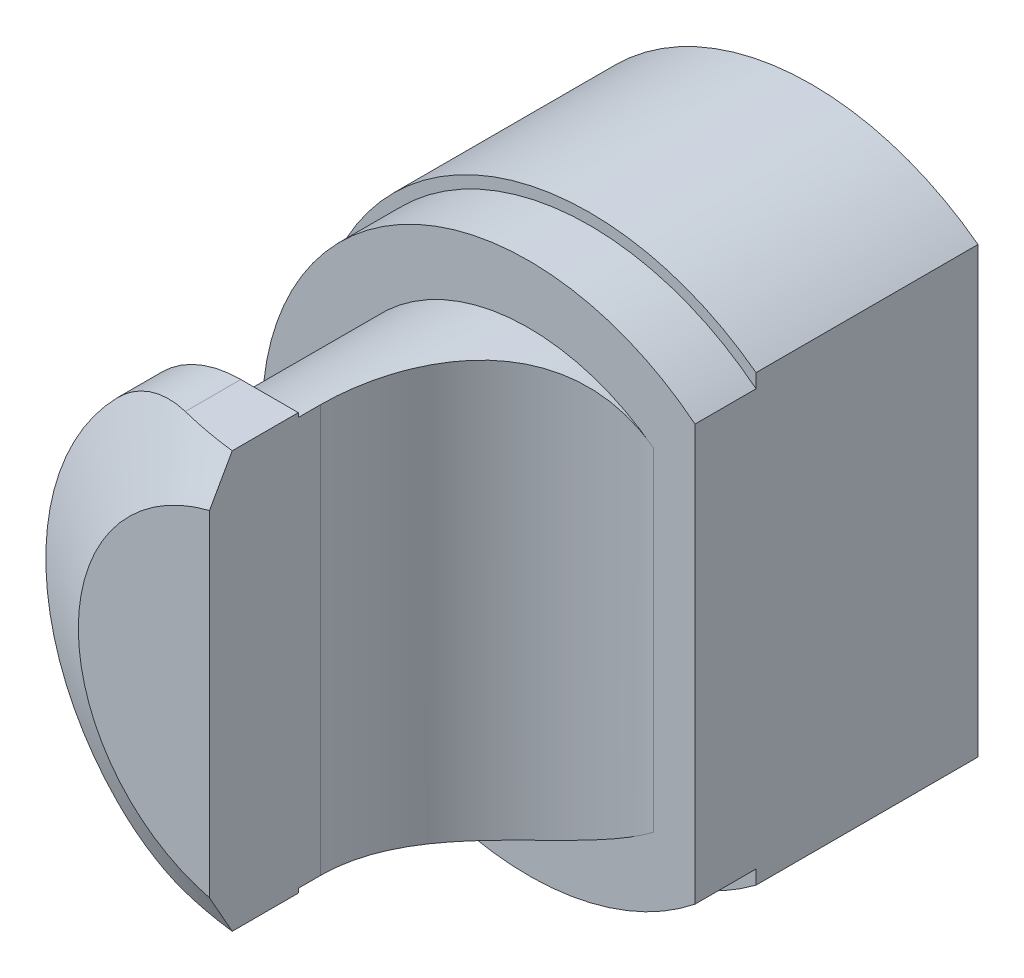
ISO-10303-21;
HEADER;
FILE_DESCRIPTION(('STEP AP214'),'2;1');
FILE_NAME('part.step','',(''),(''),'','','');
FILE_SCHEMA(('AUTOMOTIVE_DESIGN { 1 0 10303 214 1 1 1 1 }'));
ENDSEC;
DATA;
#1=APPLICATION_CONTEXT('core data for automotive mechanical design processes');
#2=APPLICATION_PROTOCOL_DEFINITION('international standard','automotive_design',2000,#1);
#3=PRODUCT_CONTEXT('',#1,'mechanical');
#4=PRODUCT('Part','Part','',(#3));
#5=PRODUCT_RELATED_PRODUCT_CATEGORY('part','',(#4));
#6=PRODUCT_DEFINITION_FORMATION('','',#4);
#7=PRODUCT_DEFINITION_CONTEXT('part definition',#1,'design');
#8=PRODUCT_DEFINITION('design','',#6,#7);
#9=PRODUCT_DEFINITION_SHAPE('','',#8);
#10=(LENGTH_UNIT() NAMED_UNIT(*) SI_UNIT(.MILLI.,.METRE.));
#11=(NAMED_UNIT(*) PLANE_ANGLE_UNIT() SI_UNIT($,.RADIAN.));
#12=(NAMED_UNIT(*) SI_UNIT($,.STERADIAN.) SOLID_ANGLE_UNIT());
#13=UNCERTAINTY_MEASURE_WITH_UNIT(LENGTH_MEASURE(1.E-05),#10,'distance_accuracy_value','');
#14=(GEOMETRIC_REPRESENTATION_CONTEXT(3) GLOBAL_UNCERTAINTY_ASSIGNED_CONTEXT((#13)) GLOBAL_UNIT_ASSIGNED_CONTEXT((#10,
#11,#12)) REPRESENTATION_CONTEXT('',''));
#15=CARTESIAN_POINT('',(0.,0.,0.));
#16=DIRECTION('',(0.,0.,1.));
#17=DIRECTION('',(1.,0.,0.));
#18=AXIS2_PLACEMENT_3D('',#15,#16,#17);
#19=CARTESIAN_POINT('',(0.,0.,3.05));
#20=DIRECTION('',(0.,0.,-1.));
#21=DIRECTION('',(-1.,0.,0.));
#22=AXIS2_PLACEMENT_3D('',#19,#20,#21);
#23=CYLINDRICAL_SURFACE('',#22,2.25);
#24=CARTESIAN_POINT('',(0.,0.,2.65));
#25=DIRECTION('',(0.,0.,1.));
#26=DIRECTION('',(1.,0.,0.));
#27=AXIS2_PLACEMENT_3D('',#24,#25,#26);
#28=CIRCLE('',#27,2.25);
#29=CARTESIAN_POINT('',(-1.60682139642214,-1.575,2.65));
#30=VERTEX_POINT('',#29);
#31=CARTESIAN_POINT('',(-1.60682139642214,1.575,2.65));
#32=VERTEX_POINT('',#31);
#33=EDGE_CURVE('E283',#30,#32,#28,.F.);
#34=ORIENTED_EDGE('',*,*,#33,.T.);
#35=DIRECTION('',(0.,0.,-1.));
#36=VECTOR('',#35,1.);
#37=CARTESIAN_POINT('',(-1.60682139642214,1.575,3.05));
#38=LINE('',#37,#36);
#39=CARTESIAN_POINT('',(-1.60682139642214,1.575,2.25));
#40=VERTEX_POINT('',#39);
#41=EDGE_CURVE('E245',#32,#40,#38,.T.);
#42=ORIENTED_EDGE('',*,*,#41,.T.);
#43=CARTESIAN_POINT('',(0.,0.,2.25));
#44=DIRECTION('',(0.,0.,1.));
#45=DIRECTION('',(1.,0.,0.));
#46=AXIS2_PLACEMENT_3D('',#43,#44,#45);
#47=CIRCLE('',#46,2.25);
#48=CARTESIAN_POINT('',(-1.60682139642214,-1.575,2.25));
#49=VERTEX_POINT('',#48);
#50=EDGE_CURVE('E310',#40,#49,#47,.T.);
#51=ORIENTED_EDGE('',*,*,#50,.T.);
#52=DIRECTION('',(0.,0.,-1.));
#53=VECTOR('',#52,1.);
#54=CARTESIAN_POINT('',(-1.60682139642214,-1.575,3.05));
#55=LINE('',#54,#53);
#56=EDGE_CURVE('E247',#49,#30,#55,.F.);
#57=ORIENTED_EDGE('',*,*,#56,.T.);
#58=EDGE_LOOP('',(#34,#42,#51,#57));
#59=FACE_BOUND('',#58,.T.);
#60=ADVANCED_FACE('F33',(#59),#23,.T.);
#61=CARTESIAN_POINT('',(0.,0.,2.25));
#62=DIRECTION('',(0.,0.,1.));
#63=DIRECTION('',(1.,0.,0.));
#64=AXIS2_PLACEMENT_3D('',#61,#62,#63);
#65=PLANE('',#64);
#66=ORIENTED_EDGE('',*,*,#50,.F.);
#67=CARTESIAN_POINT('',(-0.892678553567856,0.875,2.25));
#68=DIRECTION('',(0.,0.,1.));
#69=DIRECTION('',(1.,0.,0.));
#70=AXIS2_PLACEMENT_3D('',#67,#68,#69);
#71=CIRCLE('',#70,1.);
#72=CARTESIAN_POINT('',(-0.892678553567856,1.875,2.25));
#73=VERTEX_POINT('',#72);
#74=EDGE_CURVE('E241',#40,#73,#71,.F.);
#75=ORIENTED_EDGE('',*,*,#74,.T.);
#76=DIRECTION('',(-1.,0.,0.));
#77=VECTOR('',#76,1.);
#78=CARTESIAN_POINT('',(0.,1.875,2.25));
#79=LINE('',#78,#77);
#80=CARTESIAN_POINT('',(-0.375,1.875,2.25));
#81=VERTEX_POINT('',#80);
#82=EDGE_CURVE('E326',#81,#73,#79,.T.);
#83=ORIENTED_EDGE('',*,*,#82,.F.);
#84=DIRECTION('',(0.,-1.,0.));
#85=VECTOR('',#84,1.);
#86=CARTESIAN_POINT('',(-0.375,0.,2.25));
#87=LINE('',#86,#85);
#88=CARTESIAN_POINT('',(-0.375,1.83711730708738,2.25));
#89=VERTEX_POINT('',#88);
#90=EDGE_CURVE('E155',#81,#89,#87,.T.);
#91=ORIENTED_EDGE('',*,*,#90,.T.);
#92=CARTESIAN_POINT('',(0.,0.,2.25));
#93=DIRECTION('',(0.,0.,1.));
#94=DIRECTION('',(1.,0.,0.));
#95=AXIS2_PLACEMENT_3D('',#92,#93,#94);
#96=CIRCLE('',#95,1.875);
#97=CARTESIAN_POINT('',(-0.375,-1.83711730708738,2.25));
#98=VERTEX_POINT('',#97);
#99=EDGE_CURVE('E152',#89,#98,#96,.T.);
#100=ORIENTED_EDGE('',*,*,#99,.T.);
#101=CARTESIAN_POINT('',(-0.375,-1.875,2.25));
#102=VERTEX_POINT('',#101);
#103=EDGE_CURVE('E151',#98,#102,#87,.T.);
#104=ORIENTED_EDGE('',*,*,#103,.T.);
#105=DIRECTION('',(1.,0.,0.));
#106=VECTOR('',#105,1.);
#107=CARTESIAN_POINT('',(0.,-1.875,2.25));
#108=LINE('',#107,#106);
#109=CARTESIAN_POINT('',(-0.892678553567856,-1.875,2.25));
#110=VERTEX_POINT('',#109);
#111=EDGE_CURVE('E302',#110,#102,#108,.T.);
#112=ORIENTED_EDGE('',*,*,#111,.F.);
#113=CARTESIAN_POINT('',(-0.892678553567856,-0.875,2.25));
#114=DIRECTION('',(0.,0.,1.));
#115=DIRECTION('',(1.,0.,0.));
#116=AXIS2_PLACEMENT_3D('',#113,#114,#115);
#117=CIRCLE('',#116,1.);
#118=EDGE_CURVE('E243',#110,#49,#117,.F.);
#119=ORIENTED_EDGE('',*,*,#118,.T.);
#120=EDGE_LOOP('',(#66,#75,#83,#91,#100,#104,#112,#119));
#121=FACE_BOUND('',#120,.T.);
#122=ADVANCED_FACE('F185',(#121),#65,.F.);
#123=CARTESIAN_POINT('',(-0.375,-3.03688498979674,-5.5699004701883));
#124=DIRECTION('',(-1.,0.,0.));
#125=DIRECTION('',(0.,0.,1.));
#126=AXIS2_PLACEMENT_3D('',#123,#124,#125);
#127=PLANE('',#126);
#128=DIRECTION('',(0.,0.,-1.));
#129=VECTOR('',#128,1.);
#130=CARTESIAN_POINT('',(-0.375,-1.83711730708738,2.25));
#131=LINE('',#130,#129);
#132=CARTESIAN_POINT('',(-0.375,-1.83711730708738,2.05));
#133=VERTEX_POINT('',#132);
#134=EDGE_CURVE('E301',#133,#98,#131,.F.);
#135=ORIENTED_EDGE('',*,*,#134,.F.);
#136=DIRECTION('',(0.,1.,0.));
#137=VECTOR('',#136,1.);
#138=CARTESIAN_POINT('',(-0.375,-3.03688498979674,2.05));
#139=LINE('',#138,#137);
#140=CARTESIAN_POINT('',(-0.375,1.83711730708738,2.05));
#141=VERTEX_POINT('',#140);
#142=EDGE_CURVE('E234',#133,#141,#139,.T.);
#143=ORIENTED_EDGE('',*,*,#142,.T.);
#144=DIRECTION('',(0.,0.,-1.));
#145=VECTOR('',#144,1.);
#146=CARTESIAN_POINT('',(-0.375,1.83711730708738,2.25));
#147=LINE('',#146,#145);
#148=EDGE_CURVE('E304',#89,#141,#147,.T.);
#149=ORIENTED_EDGE('',*,*,#148,.F.);
#150=ORIENTED_EDGE('',*,*,#90,.F.);
#151=DIRECTION('',(0.,0.,-1.));
#152=VECTOR('',#151,1.);
#153=CARTESIAN_POINT('',(-0.375,1.875,-5.5699004701883));
#154=LINE('',#153,#152);
#155=CARTESIAN_POINT('',(-0.374999999984536,1.875,2.84506799738743));
#156=VERTEX_POINT('',#155);
#157=EDGE_CURVE('E351',#156,#81,#154,.T.);
#158=ORIENTED_EDGE('',*,*,#157,.F.);
#159=CARTESIAN_POINT('',(-0.375,2.21852991866236,2.65));
#160=CARTESIAN_POINT('',(-0.375,2.15968993372952,2.68349497391053));
#161=CARTESIAN_POINT('',(-0.375,2.1008350115622,2.71696375090653));
#162=CARTESIAN_POINT('',(-0.375,1.98308452700175,2.78382935955814));
#163=CARTESIAN_POINT('',(-0.375,1.9241889647183,2.81722619140692));
#164=CARTESIAN_POINT('',(-0.375,1.80634603920088,2.88392858311246));
#165=CARTESIAN_POINT('',(-0.375,1.7473986758978,2.91723414284722));
#166=CARTESIAN_POINT('',(-0.375,1.6294330290731,2.98371977517085));
#167=CARTESIAN_POINT('',(-0.375,1.57041474535898,3.0168998474181));
#168=CARTESIAN_POINT('',(-0.375,1.51135156279934,3.05));
#169=B_SPLINE_CURVE_WITH_KNOTS('',3,(#159,#160,#161,#162,#163,#164,#165,#166,#167,#168),
.UNSPECIFIED.,.F.,.F.,(4,2,2,2,4),(0.,0.203117017816692,0.406233489563516,0.609350232638408,
0.812467528260206),.UNSPECIFIED.);
#170=CARTESIAN_POINT('',(-0.375,1.51135156279934,3.05));
#171=VERTEX_POINT('',#170);
#172=EDGE_CURVE('E164',#156,#171,#169,.T.);
#173=ORIENTED_EDGE('',*,*,#172,.T.);
#174=DIRECTION('',(0.,-1.,0.));
#175=VECTOR('',#174,1.);
#176=CARTESIAN_POINT('',(-0.375,-3.03688498979674,3.05));
#177=LINE('',#176,#175);
#178=CARTESIAN_POINT('',(-0.375,-1.51135156279934,3.05));
#179=VERTEX_POINT('',#178);
#180=EDGE_CURVE('E297',#171,#179,#177,.T.);
#181=ORIENTED_EDGE('',*,*,#180,.T.);
#182=CARTESIAN_POINT('',(-0.375,-1.51135156279934,3.05));
#183=CARTESIAN_POINT('',(-0.375,-1.57041474535898,3.0168998474181));
#184=CARTESIAN_POINT('',(-0.375,-1.6294330290731,2.98371977517085));
#185=CARTESIAN_POINT('',(-0.375,-1.7473986758978,2.91723414284722));
#186=CARTESIAN_POINT('',(-0.375,-1.80634603920088,2.88392858311246));
#187=CARTESIAN_POINT('',(-0.375,-1.9241889647183,2.81722619140692));
#188=CARTESIAN_POINT('',(-0.375,-1.98308452700175,2.78382935955814));
#189=CARTESIAN_POINT('',(-0.375,-2.1008350115622,2.71696375090653));
#190=CARTESIAN_POINT('',(-0.375,-2.15968993372952,2.68349497391053));
#191=CARTESIAN_POINT('',(-0.375,-2.21852991866236,2.65));
#192=B_SPLINE_CURVE_WITH_KNOTS('',3,(#182,#183,#184,#185,#186,#187,#188,#189,#190,#191),
.UNSPECIFIED.,.F.,.F.,(4,2,2,2,4),(0.,0.203117295621798,0.40623403869669,0.609350510443514,
0.812467528260206),.UNSPECIFIED.);
#193=CARTESIAN_POINT('',(-0.375,-1.875,2.84506799738568));
#194=VERTEX_POINT('',#193);
#195=EDGE_CURVE('E171',#179,#194,#192,.T.);
#196=ORIENTED_EDGE('',*,*,#195,.T.);
#197=DIRECTION('',(0.,0.,1.));
#198=VECTOR('',#197,1.);
#199=CARTESIAN_POINT('',(-0.375,-1.875,-5.5699004701883));
#200=LINE('',#199,#198);
#201=EDGE_CURVE('E295',#102,#194,#200,.T.);
#202=ORIENTED_EDGE('',*,*,#201,.F.);
#203=ORIENTED_EDGE('',*,*,#103,.F.);
#204=EDGE_LOOP('',(#135,#143,#149,#150,#158,#173,#181,#196,#202,#203));
#205=FACE_BOUND('',#204,.T.);
#206=ADVANCED_FACE('F180',(#205),#127,.F.);
#207=CARTESIAN_POINT('',(0.,0.,3.05));
#208=DIRECTION('',(0.,0.,-1.));
#209=DIRECTION('',(-1.,0.,0.));
#210=AXIS2_PLACEMENT_3D('',#207,#208,#209);
#211=CONICAL_SURFACE('',#210,1.55717967697245,1.0471975511966);
#212=CARTESIAN_POINT('',(0.77551517420227,1.875,2.77756484727964));
#213=CARTESIAN_POINT('',(0.73007828212685,1.875,2.78759139971199));
#214=CARTESIAN_POINT('',(0.684483458480379,1.875,2.796899537944));
#215=CARTESIAN_POINT('',(0.592987609596221,1.875,2.81393435069116));
#216=CARTESIAN_POINT('',(0.547086506149714,1.875,2.82166060396105));
#217=CARTESIAN_POINT('',(0.408946001671618,1.875,2.8422462534341));
#218=CARTESIAN_POINT('',(0.316297737646359,1.875,2.85250610976308));
#219=CARTESIAN_POINT('',(0.132574886718153,1.875,2.86505167553006));
#220=CARTESIAN_POINT('',(0.041512479087597,1.875,2.8675135695237));
#221=CARTESIAN_POINT('',(-0.140443547775259,1.875,2.86474583153236));
#222=CARTESIAN_POINT('',(-0.231337228826834,1.875,2.8595200636123));
#223=CARTESIAN_POINT('',(-0.455475822604412,1.875,2.83761389509425));
#224=CARTESIAN_POINT('',(-0.588304374029833,1.875,2.81666788057499));
#225=CARTESIAN_POINT('',(-0.851406700487642,1.875,2.7622656984015));
#226=CARTESIAN_POINT('',(-0.98167722730516,1.875,2.72879458684475));
#227=CARTESIAN_POINT('',(-1.17604125726333,1.875,2.67160020743556));
#228=CARTESIAN_POINT('',(-1.24114693883111,1.875,2.65118805420931));
#229=CARTESIAN_POINT('',(-1.37068250354892,1.875,2.60844461124686));
#230=CARTESIAN_POINT('',(-1.43511277578088,1.875,2.58611450327038));
#231=CARTESIAN_POINT('',(-1.62750898786172,1.875,2.51675107355756));
#232=CARTESIAN_POINT('',(-1.75461323428828,1.875,2.46733459221373));
#233=CARTESIAN_POINT('',(-2.01195940339039,1.875,2.36210681333425));
#234=CARTESIAN_POINT('',(-2.142128637828,1.875,2.30612063741134));
#235=CARTESIAN_POINT('',(-2.40101010191744,1.875,2.19084744040797));
#236=CARTESIAN_POINT('',(-2.52972212733652,1.875,2.13155996336499));
#237=CARTESIAN_POINT('',(-2.78257485708802,1.875,2.01227436589369));
#238=CARTESIAN_POINT('',(-2.90674517642837,1.875,1.95233861984276));
#239=CARTESIAN_POINT('',(-3.15421335212192,1.875,1.83081684916809));
#240=CARTESIAN_POINT('',(-3.27751154820572,1.875,1.76923151761988));
#241=CARTESIAN_POINT('',(-3.40051517420227,1.875,1.70707999946831));
#242=B_SPLINE_CURVE_WITH_KNOTS('',3,(#212,#213,#214,#215,#216,#217,#218,#219,#220,#221,#222,
#223,#224,#225,#226,#227,#228,#229,#230,#231,#232,#233,#234,#235,#236,#237,#238,#239,#240,#241),
.UNSPECIFIED.,.F.,.F.,(4,2,2,2,2,2,2,2,2,2,2,2,2,2,4),(0.,0.139580379396184,0.279197879897776,
0.558519829828358,0.831484123500799,1.10431126345209,1.50688805165974,1.90994670040144,
2.11461530128089,2.31915868677931,2.72814235593344,3.153180427448,3.57827734983895,
3.99190030295551,4.40535211655301),.UNSPECIFIED.);
#243=CARTESIAN_POINT('',(-0.892678553567855,1.875,2.75008022484848));
#244=VERTEX_POINT('',#243);
#245=EDGE_CURVE('E352',#156,#244,#242,.T.);
#246=ORIENTED_EDGE('',*,*,#245,.T.);
#247=CARTESIAN_POINT('',(-0.892678553567856,1.875,2.75008022484848));
#248=CARTESIAN_POINT('',(-0.919581790580037,1.87499983517563,2.74340360643589));
#249=CARTESIAN_POINT('',(-0.94654864301284,1.87391341656568,2.73703072337631));
#250=CARTESIAN_POINT('',(-1.00044976138333,1.86954390462788,2.72490951054497));
#251=CARTESIAN_POINT('',(-1.02738402007079,1.86626038960332,2.71916130091531));
#252=CARTESIAN_POINT('',(-1.10791571295614,1.85307311644857,2.70287627710788));
#253=CARTESIAN_POINT('',(-1.16120835369302,1.83983256941054,2.69330737833321));
#254=CARTESIAN_POINT('',(-1.26534131029021,1.80459930711908,2.67692212436111));
#255=CARTESIAN_POINT('',(-1.31617715300775,1.78259125553994,2.67011063480731));
#256=CARTESIAN_POINT('',(-1.41366726018164,1.7303448689643,2.65938810574547));
#257=CARTESIAN_POINT('',(-1.46033087695269,1.70012558765332,2.6554704286141));
#258=CARTESIAN_POINT('',(-1.52229920166895,1.65224258491577,2.65201917017177));
#259=CARTESIAN_POINT('',(-1.53994714437921,1.63760728908143,2.65126190377883));
#260=CARTESIAN_POINT('',(-1.57418774762092,1.60716680802337,2.65025279510879));
#261=CARTESIAN_POINT('',(-1.59078142830412,1.59136278678122,2.65000045679946));
#262=CARTESIAN_POINT('',(-1.60682139642215,1.57500000000001,2.65));
#263=B_SPLINE_CURVE_WITH_KNOTS('',3,(#247,#248,#249,#250,#251,#252,#253,#254,#255,#256,#257,
#258,#259,#260,#261,#262),.UNSPECIFIED.,.F.,.F.,(4,2,2,2,2,2,2,4),(0.,0.083110970328413,
0.16623789702544,0.332594627386356,0.499243639650409,0.665509206948275,0.734279159715779,
0.802981520892254),.UNSPECIFIED.);
#264=EDGE_CURVE('E249',#244,#32,#263,.T.);
#265=ORIENTED_EDGE('',*,*,#264,.T.);
#266=ORIENTED_EDGE('',*,*,#33,.F.);
#267=CARTESIAN_POINT('',(-1.60682139642214,-1.575,2.65));
#268=CARTESIAN_POINT('',(-1.58786242240055,-1.59434249156085,2.65000035901196));
#269=CARTESIAN_POINT('',(-1.56812602686401,-1.61290406844184,2.65035314785149));
#270=CARTESIAN_POINT('',(-1.52723062387886,-1.64835408145434,2.65176225771525));
#271=CARTESIAN_POINT('',(-1.50607175665551,-1.6652426821007,2.65281850948426));
#272=CARTESIAN_POINT('',(-1.44075031834378,-1.71316684951496,2.65703435041968));
#273=CARTESIAN_POINT('',(-1.39465793156051,-1.74154724231284,2.66124104509327));
#274=CARTESIAN_POINT('',(-1.29878986773541,-1.79040991182473,2.67237405449017));
#275=CARTESIAN_POINT('',(-1.24901298871822,-1.81088959747155,2.67930125991495));
#276=CARTESIAN_POINT('',(-1.14723553087395,-1.84352939350739,2.69576186529167));
#277=CARTESIAN_POINT('',(-1.09523688643385,-1.85569659044794,2.70529303558515));
#278=CARTESIAN_POINT('',(-1.01790981709724,-1.86745115807895,2.72117401293372));
#279=CARTESIAN_POINT('',(-0.992837887320423,-1.87028978770985,2.72658505946397));
#280=CARTESIAN_POINT('',(-0.94271862695668,-1.87406227341835,2.7379374154138));
#281=CARTESIAN_POINT('',(-0.917671334484993,-1.87499958215895,2.74387774317317));
#282=CARTESIAN_POINT('',(-0.892678553567861,-1.8750000000001,2.75008022484843));
#283=B_SPLINE_CURVE_WITH_KNOTS('',3,(#267,#268,#269,#270,#271,#272,#273,#274,#275,#276,#277,
#278,#279,#280,#281,#282),.UNSPECIFIED.,.F.,.F.,(4,2,2,2,2,2,2,4),(0.,0.0812024122390972,
0.162396831363084,0.32442668667394,0.486509635215342,0.648454232016024,0.725807777349448,
0.803020727962151),.UNSPECIFIED.);
#284=CARTESIAN_POINT('',(-0.892678553567856,-1.875,2.75008022484848));
#285=VERTEX_POINT('',#284);
#286=EDGE_CURVE('E254',#30,#285,#283,.T.);
#287=ORIENTED_EDGE('',*,*,#286,.T.);
#288=CARTESIAN_POINT('',(-3.40051517420227,-1.875,1.70707999946831));
#289=CARTESIAN_POINT('',(-3.32011162089172,-1.875,1.74772691992684));
#290=CARTESIAN_POINT('',(-3.23957562365413,-1.875,1.788113315058));
#291=CARTESIAN_POINT('',(-3.07818183879897,-1.875,1.86824314469414));
#292=CARTESIAN_POINT('',(-2.99732404238453,-1.875,1.90798656146984));
#293=CARTESIAN_POINT('',(-2.75389341781242,-1.875,2.02620979858071));
#294=CARTESIAN_POINT('',(-2.5907564462367,-1.875,2.10353333071429));
#295=CARTESIAN_POINT('',(-2.25612297687946,-1.875,2.25643046487578));
#296=CARTESIAN_POINT('',(-2.08454399141789,-1.875,2.33182666336692));
#297=CARTESIAN_POINT('',(-1.82474931588355,-1.875,2.43888213201205));
#298=CARTESIAN_POINT('',(-1.73777809093127,-1.875,2.47354955802523));
#299=CARTESIAN_POINT('',(-1.56281577403669,-1.875,2.54029250572317));
#300=CARTESIAN_POINT('',(-1.47482442792011,-1.875,2.57236736485071));
#301=CARTESIAN_POINT('',(-1.27882811849963,-1.875,2.63964173794156));
#302=CARTESIAN_POINT('',(-1.17054848362292,-1.875,2.67405392294251));
#303=CARTESIAN_POINT('',(-0.952105095623159,-1.875,2.73617461098296));
#304=CARTESIAN_POINT('',(-0.841942402764982,-1.875,2.76388676149848));
#305=CARTESIAN_POINT('',(-0.621195669234501,-1.875,2.81016488645846));
#306=CARTESIAN_POINT('',(-0.510636881117493,-1.875,2.82884800865325));
#307=CARTESIAN_POINT('',(-0.288261129882068,-1.875,2.8555782809547));
#308=CARTESIAN_POINT('',(-0.176445199994456,-1.875,2.86363360140799));
#309=CARTESIAN_POINT('',(0.0054518073222194,-1.875,2.8672610219293));
#310=CARTESIAN_POINT('',(0.0754776713002997,-1.875,2.86637874224703));
#311=CARTESIAN_POINT('',(0.215347744136933,-1.875,2.86013279317167));
#312=CARTESIAN_POINT('',(0.285191909027755,-1.875,2.85476812497092));
#313=CARTESIAN_POINT('',(0.425532151849088,-1.875,2.8397028955105));
#314=CARTESIAN_POINT('',(0.496020729961982,-1.875,2.82993420114444));
#315=CARTESIAN_POINT('',(0.636311737806758,-1.875,2.8065292485376));
#316=CARTESIAN_POINT('',(0.706114568588122,-1.875,2.7928954096622));
#317=CARTESIAN_POINT('',(0.77551517420227,-1.875,2.77756484727964));
#318=B_SPLINE_CURVE_WITH_KNOTS('',3,(#288,#289,#290,#291,#292,#293,#294,#295,#296,#297,#298,
#299,#300,#301,#302,#303,#304,#305,#306,#307,#308,#309,#310,#311,#312,#313,#314,#315,#316,#317),
.UNSPECIFIED.,.F.,.F.,(4,2,2,2,2,2,2,2,2,2,2,2,2,2,4),(0.,0.270281856000906,0.540571152012483,
1.08213634234132,1.64422777062576,1.92507376251643,2.20599130204925,2.5466822951628,
2.88718739751276,3.22314735507867,3.55884888555888,3.76880859503538,3.97881510217545,
4.19218837931096,4.40542839042843),.UNSPECIFIED.);
#319=EDGE_CURVE('E300',#285,#194,#318,.T.);
#320=ORIENTED_EDGE('',*,*,#319,.T.);
#321=ORIENTED_EDGE('',*,*,#195,.F.);
#322=CARTESIAN_POINT('',(0.,0.,3.05));
#323=DIRECTION('',(0.,0.,1.));
#324=DIRECTION('',(1.,0.,0.));
#325=AXIS2_PLACEMENT_3D('',#322,#323,#324);
#326=CIRCLE('',#325,1.55717967697245);
#327=EDGE_CURVE('E161',#171,#179,#326,.T.);
#328=ORIENTED_EDGE('',*,*,#327,.F.);
#329=ORIENTED_EDGE('',*,*,#172,.F.);
#330=EDGE_LOOP('',(#246,#265,#266,#287,#320,#321,#328,#329));
#331=FACE_BOUND('',#330,.T.);
#332=ADVANCED_FACE('F176',(#331),#211,.T.);
#333=CARTESIAN_POINT('',(0.,0.,0.55));
#334=DIRECTION('',(0.,0.,-1.));
#335=DIRECTION('',(-1.,0.,0.));
#336=AXIS2_PLACEMENT_3D('',#333,#334,#335);
#337=CYLINDRICAL_SURFACE('',#336,2.4);
#338=CARTESIAN_POINT('',(0.,0.,0.55));
#339=DIRECTION('',(0.,0.,1.));
#340=DIRECTION('',(1.,0.,0.));
#341=AXIS2_PLACEMENT_3D('',#338,#339,#340);
#342=CIRCLE('',#341,2.4);
#343=CARTESIAN_POINT('',(1.5,1.87349939951952,0.55));
#344=VERTEX_POINT('',#343);
#345=CARTESIAN_POINT('',(1.5,-1.87349939951952,0.55));
#346=VERTEX_POINT('',#345);
#347=EDGE_CURVE('E147',#344,#346,#342,.T.);
#348=ORIENTED_EDGE('',*,*,#347,.F.);
#349=DIRECTION('',(0.,0.,-1.));
#350=VECTOR('',#349,1.);
#351=CARTESIAN_POINT('',(1.5,1.87349939951952,0.55));
#352=LINE('',#351,#350);
#353=CARTESIAN_POINT('',(1.5,1.87349939951952,0.));
#354=VERTEX_POINT('',#353);
#355=EDGE_CURVE('E133',#344,#354,#352,.T.);
#356=ORIENTED_EDGE('',*,*,#355,.T.);
#357=CARTESIAN_POINT('',(0.,0.,0.));
#358=DIRECTION('',(0.,0.,-1.));
#359=DIRECTION('',(-1.,0.,0.));
#360=AXIS2_PLACEMENT_3D('',#357,#358,#359);
#361=CIRCLE('',#360,2.4);
#362=CARTESIAN_POINT('',(1.5,-1.87349939951952,0.));
#363=VERTEX_POINT('',#362);
#364=EDGE_CURVE('E317',#363,#354,#361,.T.);
#365=ORIENTED_EDGE('',*,*,#364,.F.);
#366=DIRECTION('',(0.,0.,-1.));
#367=VECTOR('',#366,1.);
#368=CARTESIAN_POINT('',(1.5,-1.87349939951952,0.55));
#369=LINE('',#368,#367);
#370=EDGE_CURVE('E150',#363,#346,#369,.F.);
#371=ORIENTED_EDGE('',*,*,#370,.T.);
#372=EDGE_LOOP('',(#348,#356,#365,#371));
#373=FACE_BOUND('',#372,.T.);
#374=ADVANCED_FACE('F149',(#373),#337,.T.);
#375=CARTESIAN_POINT('',(0.,0.,0.55));
#376=DIRECTION('',(0.,0.,1.));
#377=DIRECTION('',(1.,0.,0.));
#378=AXIS2_PLACEMENT_3D('',#375,#376,#377);
#379=PLANE('',#378);
#380=DIRECTION('',(0.,-1.,0.));
#381=VECTOR('',#380,1.);
#382=CARTESIAN_POINT('',(1.5,3.33616587553346,0.55));
#383=LINE('',#382,#381);
#384=EDGE_CURVE('E136',#344,#346,#383,.T.);
#385=ORIENTED_EDGE('',*,*,#384,.F.);
#386=ORIENTED_EDGE('',*,*,#347,.T.);
#387=EDGE_LOOP('',(#385,#386));
#388=FACE_BOUND('',#387,.T.);
#389=CARTESIAN_POINT('',(0.,0.,0.55));
#390=DIRECTION('',(0.,0.,1.));
#391=DIRECTION('',(1.,0.,0.));
#392=AXIS2_PLACEMENT_3D('',#389,#390,#391);
#393=CIRCLE('',#392,1.875);
#394=CARTESIAN_POINT('',(1.125,1.5,0.55));
#395=VERTEX_POINT('',#394);
#396=CARTESIAN_POINT('',(1.125,-1.5,0.55));
#397=VERTEX_POINT('',#396);
#398=EDGE_CURVE('E56',#395,#397,#393,.T.);
#399=ORIENTED_EDGE('',*,*,#398,.F.);
#400=DIRECTION('',(0.,1.,0.));
#401=VECTOR('',#400,1.);
#402=CARTESIAN_POINT('',(1.125,0.,0.55));
#403=LINE('',#402,#401);
#404=EDGE_CURVE('E231',#395,#397,#403,.F.);
#405=ORIENTED_EDGE('',*,*,#404,.T.);
#406=EDGE_LOOP('',(#399,#405));
#407=FACE_BOUND('',#406,.T.);
#408=ADVANCED_FACE('F146',(#388,#407),#379,.T.);
#409=CARTESIAN_POINT('',(0.,0.,2.25));
#410=DIRECTION('',(0.,0.,-1.));
#411=DIRECTION('',(-1.,0.,0.));
#412=AXIS2_PLACEMENT_3D('',#409,#410,#411);
#413=CYLINDRICAL_SURFACE('',#412,1.875);
#414=ORIENTED_EDGE('',*,*,#99,.F.);
#415=ORIENTED_EDGE('',*,*,#148,.T.);
#416=CARTESIAN_POINT('',(-0.375,1.83711730708738,2.05));
#417=CARTESIAN_POINT('',(-0.375004552764185,1.83710537216745,2.00796201936872));
#418=CARTESIAN_POINT('',(-0.373232879866697,1.83747775610632,1.9659275450426));
#419=CARTESIAN_POINT('',(-0.366173032103907,1.83890346745088,1.88217506509932));
#420=CARTESIAN_POINT('',(-0.360885591874861,1.83995665259865,1.84045699520946));
#421=CARTESIAN_POINT('',(-0.346840900689356,1.84265427174096,1.75769243084274));
#422=CARTESIAN_POINT('',(-0.338088979415664,1.84429779721069,1.7166450051881));
#423=CARTESIAN_POINT('',(-0.317189753763766,1.84800633204701,1.63545427768972));
#424=CARTESIAN_POINT('',(-0.305042350929774,1.85007135363489,1.59531100209929));
#425=CARTESIAN_POINT('',(-0.263625603667545,1.85658792043507,1.4766572594062));
#426=CARTESIAN_POINT('',(-0.229367596701461,1.86136440423793,1.39984021436868));
#427=CARTESIAN_POINT('',(-0.148464580529811,1.86955275288994,1.25292170472738));
#428=CARTESIAN_POINT('',(-0.101811353916481,1.87296370868829,1.18282473730392));
#429=CARTESIAN_POINT('',(0.00281796059605152,1.87572943844984,1.05110182841691));
#430=CARTESIAN_POINT('',(0.0608319476231463,1.87507040393986,0.98950545056298));
#431=CARTESIAN_POINT('',(0.186059480419713,1.86679339908207,0.8772108375068));
#432=CARTESIAN_POINT('',(0.253254387838058,1.85918935453997,0.826491044298582));
#433=CARTESIAN_POINT('',(0.387480372802021,1.83567215543846,0.741647612147141));
#434=CARTESIAN_POINT('',(0.453964032184338,1.8205828163015,0.70643016274355));
#435=CARTESIAN_POINT('',(0.589320260810436,1.78136913126852,0.646965173490757));
#436=CARTESIAN_POINT('',(0.658195975040664,1.75723244811086,0.622732713288587));
#437=CARTESIAN_POINT('',(0.761143648557561,1.71397513868404,0.594351981380899));
#438=CARTESIAN_POINT('',(0.79562482048311,1.69825302135531,0.586192901055376));
#439=CARTESIAN_POINT('',(0.863997049890836,1.66450704219574,0.572471745321483));
#440=CARTESIAN_POINT('',(0.897887926944394,1.64648249016455,0.566910450988389));
#441=CARTESIAN_POINT('',(0.964725436007457,1.60823277544453,0.558206090121477));
#442=CARTESIAN_POINT('',(0.997671836113964,1.58800707804449,0.555063612679926));
#443=CARTESIAN_POINT('',(1.06232429880753,1.54550786755225,0.550959344358694));
#444=CARTESIAN_POINT('',(1.09403127989424,1.52323591353043,0.549995907343959));
#445=CARTESIAN_POINT('',(1.125,1.5,0.550000000000001));
#446=B_SPLINE_CURVE_WITH_KNOTS('',3,(#416,#417,#418,#419,#420,#421,#422,#423,#424,#425,#426,
#427,#428,#429,#430,#431,#432,#433,#434,#435,#436,#437,#438,#439,#440,#441,#442,#443,#444,#445),
.UNSPECIFIED.,.F.,.F.,(4,2,2,2,2,2,2,2,2,2,2,2,2,2,4),(0.,0.126068990429907,0.252111646421238,
0.377961149997567,0.503814303099614,0.755271965360751,1.00689674918787,1.25937570176459,
1.51134950429429,1.74027110940038,1.96950602208078,2.08566677589639,2.20186243327431,
2.31808638064979,2.43422249839831),.UNSPECIFIED.);
#447=EDGE_CURVE('E220',#141,#395,#446,.T.);
#448=ORIENTED_EDGE('',*,*,#447,.T.);
#449=ORIENTED_EDGE('',*,*,#398,.T.);
#450=CARTESIAN_POINT('',(1.125,-1.5,0.55));
#451=CARTESIAN_POINT('',(1.09588782348741,-1.52184130300302,0.549996919779177));
#452=CARTESIAN_POINT('',(1.06612539752371,-1.54283142392949,0.550847733416645));
#453=CARTESIAN_POINT('',(1.0054948136089,-1.58301081368275,0.554460186884151));
#454=CARTESIAN_POINT('',(0.974625957095862,-1.60219891608618,0.557223054811679));
#455=CARTESIAN_POINT('',(0.911992923399704,-1.6386604144713,0.564865905309275));
#456=CARTESIAN_POINT('',(0.880228123071106,-1.65593243442992,0.569747397155656));
#457=CARTESIAN_POINT('',(0.816118430485685,-1.68845216795892,0.581783871407095));
#458=CARTESIAN_POINT('',(0.783773678486818,-1.7037003636798,0.588938310927799));
#459=CARTESIAN_POINT('',(0.686018037002781,-1.7464393772153,0.614098105512498));
#460=CARTESIAN_POINT('',(0.620105452914931,-1.77079797337521,0.635775741604135));
#461=CARTESIAN_POINT('',(0.489996507117379,-1.81112519774239,0.689222915285007));
#462=CARTESIAN_POINT('',(0.425797623668987,-1.82710688164421,0.720976624219065));
#463=CARTESIAN_POINT('',(0.304797099035506,-1.851036816529,0.792245329490819));
#464=CARTESIAN_POINT('',(0.247785330723824,-1.85935208022533,0.831283837869084));
#465=CARTESIAN_POINT('',(0.139354402601947,-1.87061076683802,0.917173766253585));
#466=CARTESIAN_POINT('',(0.0879405824570728,-1.87354910240686,0.964032539672933));
#467=CARTESIAN_POINT('',(-0.0110335590469758,-1.87566354459223,1.06771038582215));
#468=CARTESIAN_POINT('',(-0.0581274894023441,-1.87458320726055,1.1249784177904));
#469=CARTESIAN_POINT('',(-0.143336296553431,-1.87000119539065,1.24576587183461));
#470=CARTESIAN_POINT('',(-0.181446540797871,-1.86649827526338,1.30928849533964));
#471=CARTESIAN_POINT('',(-0.251586046746478,-1.85841751670975,1.44854784660642));
#472=CARTESIAN_POINT('',(-0.282471497659407,-1.85376353685917,1.52485777291882));
#473=CARTESIAN_POINT('',(-0.331343110640665,-1.84565960806111,1.68151707031121));
#474=CARTESIAN_POINT('',(-0.349343841513866,-1.84220830152016,1.76186176885724));
#475=CARTESIAN_POINT('',(-0.365438113723879,-1.83904800139119,1.87737866653711));
#476=CARTESIAN_POINT('',(-0.369024439586486,-1.83832892634672,1.91182852512879));
#477=CARTESIAN_POINT('',(-0.37380310186914,-1.83736247089288,1.98084729424239));
#478=CARTESIAN_POINT('',(-0.374999103369525,-1.83711436837148,2.01541594096527));
#479=CARTESIAN_POINT('',(-0.375,-1.83711730708738,2.05));
#480=B_SPLINE_CURVE_WITH_KNOTS('',3,(#450,#451,#452,#453,#454,#455,#456,#457,#458,#459,#460,
#461,#462,#463,#464,#465,#466,#467,#468,#469,#470,#471,#472,#473,#474,#475,#476,#477,#478,#479),
.UNSPECIFIED.,.F.,.F.,(4,2,2,2,2,2,2,2,2,2,2,2,2,2,4),(0.,0.109171401623282,0.218412988339631,
0.327732525211351,0.437025971159264,0.656366816485322,0.875364787696559,1.08323228743307,
1.29129635824096,1.51285871515691,1.7345350747895,1.98080631044433,2.22679864445104,
2.33065813049958,2.43435824642333),.UNSPECIFIED.);
#481=EDGE_CURVE('E225',#397,#133,#480,.T.);
#482=ORIENTED_EDGE('',*,*,#481,.T.);
#483=ORIENTED_EDGE('',*,*,#134,.T.);
#484=EDGE_LOOP('',(#414,#415,#448,#449,#482,#483));
#485=FACE_BOUND('',#484,.T.);
#486=ADVANCED_FACE('F212',(#485),#413,.T.);
#487=CARTESIAN_POINT('',(0.,0.,-2.));
#488=DIRECTION('',(0.,0.,1.));
#489=DIRECTION('',(1.,0.,0.));
#490=AXIS2_PLACEMENT_3D('',#487,#488,#489);
#491=CYLINDRICAL_SURFACE('',#490,2.5);
#492=CARTESIAN_POINT('',(0.,0.,-2.));
#493=DIRECTION('',(0.,0.,-1.));
#494=DIRECTION('',(-1.,0.,0.));
#495=AXIS2_PLACEMENT_3D('',#492,#493,#494);
#496=CIRCLE('',#495,2.5);
#497=CARTESIAN_POINT('',(1.5,-2.,-2.));
#498=VERTEX_POINT('',#497);
#499=CARTESIAN_POINT('',(1.5,2.,-2.));
#500=VERTEX_POINT('',#499);
#501=EDGE_CURVE('E314',#498,#500,#496,.T.);
#502=ORIENTED_EDGE('',*,*,#501,.F.);
#503=DIRECTION('',(0.,0.,1.));
#504=VECTOR('',#503,1.);
#505=CARTESIAN_POINT('',(1.5,-2.,-2.));
#506=LINE('',#505,#504);
#507=CARTESIAN_POINT('',(1.5,-2.,0.));
#508=VERTEX_POINT('',#507);
#509=EDGE_CURVE('E364',#498,#508,#506,.T.);
#510=ORIENTED_EDGE('',*,*,#509,.T.);
#511=CARTESIAN_POINT('',(0.,0.,0.));
#512=DIRECTION('',(0.,0.,-1.));
#513=DIRECTION('',(-1.,0.,0.));
#514=AXIS2_PLACEMENT_3D('',#511,#512,#513);
#515=CIRCLE('',#514,2.5);
#516=CARTESIAN_POINT('',(1.5,2.,0.));
#517=VERTEX_POINT('',#516);
#518=EDGE_CURVE('E313',#508,#517,#515,.T.);
#519=ORIENTED_EDGE('',*,*,#518,.T.);
#520=DIRECTION('',(0.,0.,1.));
#521=VECTOR('',#520,1.);
#522=CARTESIAN_POINT('',(1.5,2.,-2.));
#523=LINE('',#522,#521);
#524=EDGE_CURVE('E49',#517,#500,#523,.F.);
#525=ORIENTED_EDGE('',*,*,#524,.T.);
#526=EDGE_LOOP('',(#502,#510,#519,#525));
#527=FACE_BOUND('',#526,.T.);
#528=ADVANCED_FACE('F205',(#527),#491,.T.);
#529=CARTESIAN_POINT('',(0.,0.,-2.));
#530=DIRECTION('',(0.,0.,-1.));
#531=DIRECTION('',(-1.,0.,0.));
#532=AXIS2_PLACEMENT_3D('',#529,#530,#531);
#533=PLANE('',#532);
#534=DIRECTION('',(0.,1.,0.));
#535=VECTOR('',#534,1.);
#536=CARTESIAN_POINT('',(1.5,0.,-2.));
#537=LINE('',#536,#535);
#538=EDGE_CURVE('E142',#498,#500,#537,.T.);
#539=ORIENTED_EDGE('',*,*,#538,.F.);
#540=ORIENTED_EDGE('',*,*,#501,.T.);
#541=EDGE_LOOP('',(#539,#540));
#542=FACE_BOUND('',#541,.T.);
#543=CARTESIAN_POINT('',(0.,0.,-2.));
#544=DIRECTION('',(0.,0.,-1.));
#545=DIRECTION('',(-1.,0.,0.));
#546=AXIS2_PLACEMENT_3D('',#543,#544,#545);
#547=CIRCLE('',#546,1.);
#548=CARTESIAN_POINT('',(-1.,0.,-2.));
#549=VERTEX_POINT('',#548);
#550=EDGE_CURVE('E359',#549,#549,#547,.T.);
#551=ORIENTED_EDGE('',*,*,#550,.F.);
#552=EDGE_LOOP('',(#551));
#553=FACE_BOUND('',#552,.T.);
#554=ADVANCED_FACE('F202',(#542,#553),#533,.T.);
#555=CARTESIAN_POINT('',(0.,0.,0.));
#556=DIRECTION('',(0.,0.,-1.));
#557=DIRECTION('',(-1.,0.,0.));
#558=AXIS2_PLACEMENT_3D('',#555,#556,#557);
#559=PLANE('',#558);
#560=ORIENTED_EDGE('',*,*,#518,.F.);
#561=DIRECTION('',(0.,1.,0.));
#562=VECTOR('',#561,1.);
#563=CARTESIAN_POINT('',(1.5,0.,0.));
#564=LINE('',#563,#562);
#565=EDGE_CURVE('E11',#508,#363,#564,.T.);
#566=ORIENTED_EDGE('',*,*,#565,.T.);
#567=ORIENTED_EDGE('',*,*,#364,.T.);
#568=EDGE_CURVE('E38',#354,#517,#564,.T.);
#569=ORIENTED_EDGE('',*,*,#568,.T.);
#570=EDGE_LOOP('',(#560,#566,#567,#569));
#571=FACE_BOUND('',#570,.T.);
#572=ADVANCED_FACE('F194',(#571),#559,.F.);
#573=CARTESIAN_POINT('',(0.,0.,3.05));
#574=DIRECTION('',(0.,0.,1.));
#575=DIRECTION('',(1.,0.,0.));
#576=AXIS2_PLACEMENT_3D('',#573,#574,#575);
#577=PLANE('',#576);
#578=ORIENTED_EDGE('',*,*,#180,.F.);
#579=ORIENTED_EDGE('',*,*,#327,.T.);
#580=EDGE_LOOP('',(#578,#579));
#581=FACE_BOUND('',#580,.T.);
#582=ADVANCED_FACE('F190',(#581),#577,.T.);
#583=CARTESIAN_POINT('',(-3.27929292204837,1.875,1.05));
#584=DIRECTION('',(0.,1.,0.));
#585=DIRECTION('',(0.,0.,1.));
#586=AXIS2_PLACEMENT_3D('',#583,#584,#585);
#587=PLANE('',#586);
#588=ORIENTED_EDGE('',*,*,#82,.T.);
#589=DIRECTION('',(0.,0.,1.));
#590=VECTOR('',#589,1.);
#591=CARTESIAN_POINT('',(-0.892678553567856,1.875,2.65));
#592=LINE('',#591,#590);
#593=EDGE_CURVE('E281',#73,#244,#592,.T.);
#594=ORIENTED_EDGE('',*,*,#593,.T.);
#595=ORIENTED_EDGE('',*,*,#245,.F.);
#596=ORIENTED_EDGE('',*,*,#157,.T.);
#597=EDGE_LOOP('',(#588,#594,#595,#596));
#598=FACE_BOUND('',#597,.T.);
#599=ADVANCED_FACE('F187',(#598),#587,.T.);
#600=CARTESIAN_POINT('',(-3.27929292204837,-1.875,1.05));
#601=DIRECTION('',(0.,-1.,0.));
#602=DIRECTION('',(0.,0.,-1.));
#603=AXIS2_PLACEMENT_3D('',#600,#601,#602);
#604=PLANE('',#603);
#605=ORIENTED_EDGE('',*,*,#319,.F.);
#606=DIRECTION('',(0.,0.,1.));
#607=VECTOR('',#606,1.);
#608=CARTESIAN_POINT('',(-0.892678553567856,-1.875,2.25));
#609=LINE('',#608,#607);
#610=EDGE_CURVE('E236',#285,#110,#609,.F.);
#611=ORIENTED_EDGE('',*,*,#610,.T.);
#612=ORIENTED_EDGE('',*,*,#111,.T.);
#613=ORIENTED_EDGE('',*,*,#201,.T.);
#614=EDGE_LOOP('',(#605,#611,#612,#613));
#615=FACE_BOUND('',#614,.T.);
#616=ADVANCED_FACE('F263',(#615),#604,.T.);
#617=CARTESIAN_POINT('',(-0.892678553567856,0.875,3.05));
#618=DIRECTION('',(0.,0.,-1.));
#619=DIRECTION('',(-1.,0.,0.));
#620=AXIS2_PLACEMENT_3D('',#617,#618,#619);
#621=CYLINDRICAL_SURFACE('',#620,1.);
#622=ORIENTED_EDGE('',*,*,#74,.F.);
#623=ORIENTED_EDGE('',*,*,#41,.F.);
#624=ORIENTED_EDGE('',*,*,#264,.F.);
#625=ORIENTED_EDGE('',*,*,#593,.F.);
#626=EDGE_LOOP('',(#622,#623,#624,#625));
#627=FACE_BOUND('',#626,.T.);
#628=ADVANCED_FACE('F259',(#627),#621,.T.);
#629=CARTESIAN_POINT('',(-0.892678553567856,-0.875,3.05));
#630=DIRECTION('',(0.,0.,-1.));
#631=DIRECTION('',(-1.,0.,0.));
#632=AXIS2_PLACEMENT_3D('',#629,#630,#631);
#633=CYLINDRICAL_SURFACE('',#632,1.);
#634=ORIENTED_EDGE('',*,*,#286,.F.);
#635=ORIENTED_EDGE('',*,*,#56,.F.);
#636=ORIENTED_EDGE('',*,*,#118,.F.);
#637=ORIENTED_EDGE('',*,*,#610,.F.);
#638=EDGE_LOOP('',(#634,#635,#636,#637));
#639=FACE_BOUND('',#638,.T.);
#640=ADVANCED_FACE('F262',(#639),#633,.T.);
#641=CARTESIAN_POINT('',(0.,0.,0.));
#642=DIRECTION('',(0.,0.,-1.));
#643=DIRECTION('',(-1.,0.,0.));
#644=AXIS2_PLACEMENT_3D('',#641,#642,#643);
#645=CYLINDRICAL_SURFACE('',#644,1.);
#646=CARTESIAN_POINT('',(0.,0.,0.));
#647=DIRECTION('',(0.,0.,-1.));
#648=DIRECTION('',(-1.,0.,0.));
#649=AXIS2_PLACEMENT_3D('',#646,#647,#648);
#650=CIRCLE('',#649,1.);
#651=CARTESIAN_POINT('',(-1.,0.,0.));
#652=VERTEX_POINT('',#651);
#653=EDGE_CURVE('E353',#652,#652,#650,.T.);
#654=ORIENTED_EDGE('',*,*,#653,.F.);
#655=EDGE_LOOP('',(#654));
#656=FACE_BOUND('',#655,.T.);
#657=ORIENTED_EDGE('',*,*,#550,.T.);
#658=EDGE_LOOP('',(#657));
#659=FACE_BOUND('',#658,.T.);
#660=ADVANCED_FACE('F267',(#656,#659),#645,.F.);
#661=CARTESIAN_POINT('',(0.,0.,0.));
#662=DIRECTION('',(0.,0.,-1.));
#663=DIRECTION('',(-1.,0.,0.));
#664=AXIS2_PLACEMENT_3D('',#661,#662,#663);
#665=PLANE('',#664);
#666=ORIENTED_EDGE('',*,*,#653,.T.);
#667=EDGE_LOOP('',(#666));
#668=FACE_BOUND('',#667,.T.);
#669=ADVANCED_FACE('F272',(#668),#665,.T.);
#670=CARTESIAN_POINT('',(1.125,-3.03688498979674,2.05));
#671=DIRECTION('',(0.,1.,0.));
#672=DIRECTION('',(0.,0.,1.));
#673=AXIS2_PLACEMENT_3D('',#670,#671,#672);
#674=CYLINDRICAL_SURFACE('',#673,1.5);
#675=ORIENTED_EDGE('',*,*,#481,.F.);
#676=ORIENTED_EDGE('',*,*,#404,.F.);
#677=ORIENTED_EDGE('',*,*,#447,.F.);
#678=ORIENTED_EDGE('',*,*,#142,.F.);
#679=EDGE_LOOP('',(#675,#676,#677,#678));
#680=FACE_BOUND('',#679,.T.);
#681=ADVANCED_FACE('F35',(#680),#674,.F.);
#682=CARTESIAN_POINT('',(1.5,3.33616587553346,-9.45));
#683=DIRECTION('',(-1.,0.,0.));
#684=DIRECTION('',(0.,-1.,0.));
#685=AXIS2_PLACEMENT_3D('',#682,#683,#684);
#686=PLANE('',#685);
#687=ORIENTED_EDGE('',*,*,#565,.F.);
#688=ORIENTED_EDGE('',*,*,#509,.F.);
#689=ORIENTED_EDGE('',*,*,#538,.T.);
#690=ORIENTED_EDGE('',*,*,#524,.F.);
#691=ORIENTED_EDGE('',*,*,#568,.F.);
#692=ORIENTED_EDGE('',*,*,#355,.F.);
#693=ORIENTED_EDGE('',*,*,#384,.T.);
#694=ORIENTED_EDGE('',*,*,#370,.F.);
#695=EDGE_LOOP('',(#687,#688,#689,#690,#691,#692,#693,#694));
#696=FACE_BOUND('',#695,.T.);
#697=ADVANCED_FACE('F135',(#696),#686,.F.);
#698=CLOSED_SHELL('',(#60,#122,#206,#332,#374,#408,#486,#528,#554,#572,#582,#599,#616,#628,#640,
#660,#669,#681,#697));
#699=MANIFOLD_SOLID_BREP('B2',#698);
#700=ADVANCED_BREP_SHAPE_REPRESENTATION('',(#18,#699),#14);
#701=SHAPE_DEFINITION_REPRESENTATION(#9,#700);
ENDSEC;
END-ISO-10303-21;
